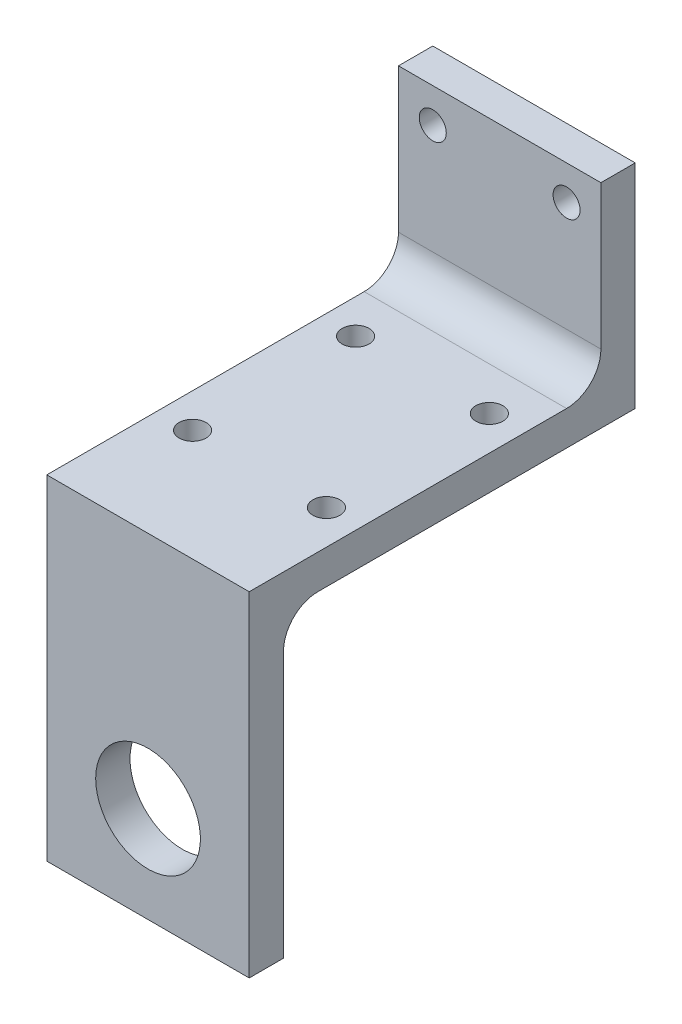
ISO-10303-21;
HEADER;
FILE_DESCRIPTION(('STEP AP214'),'2;1');
FILE_NAME('part.step','',(''),(''),'','','');
FILE_SCHEMA(('AUTOMOTIVE_DESIGN { 1 0 10303 214 1 1 1 1 }'));
ENDSEC;
DATA;
#1=APPLICATION_CONTEXT('core data for automotive mechanical design processes');
#2=APPLICATION_PROTOCOL_DEFINITION('international standard','automotive_design',2000,#1);
#3=PRODUCT_CONTEXT('',#1,'mechanical');
#4=PRODUCT('Part','Part','',(#3));
#5=PRODUCT_RELATED_PRODUCT_CATEGORY('part','',(#4));
#6=PRODUCT_DEFINITION_FORMATION('','',#4);
#7=PRODUCT_DEFINITION_CONTEXT('part definition',#1,'design');
#8=PRODUCT_DEFINITION('design','',#6,#7);
#9=PRODUCT_DEFINITION_SHAPE('','',#8);
#10=(LENGTH_UNIT() NAMED_UNIT(*) SI_UNIT(.MILLI.,.METRE.));
#11=(NAMED_UNIT(*) PLANE_ANGLE_UNIT() SI_UNIT($,.RADIAN.));
#12=(NAMED_UNIT(*) SI_UNIT($,.STERADIAN.) SOLID_ANGLE_UNIT());
#13=UNCERTAINTY_MEASURE_WITH_UNIT(LENGTH_MEASURE(1.E-05),#10,'distance_accuracy_value','');
#14=(GEOMETRIC_REPRESENTATION_CONTEXT(3) GLOBAL_UNCERTAINTY_ASSIGNED_CONTEXT((#13)) GLOBAL_UNIT_ASSIGNED_CONTEXT((#10,
#11,#12)) REPRESENTATION_CONTEXT('',''));
#15=CARTESIAN_POINT('',(0.,0.,0.));
#16=DIRECTION('',(0.,0.,1.));
#17=DIRECTION('',(1.,0.,0.));
#18=AXIS2_PLACEMENT_3D('',#15,#16,#17);
#19=CARTESIAN_POINT('',(29.972,0.,36.5701998870482));
#20=DIRECTION('',(0.,0.,-1.));
#21=DIRECTION('',(-1.,0.,0.));
#22=AXIS2_PLACEMENT_3D('',#19,#20,#21);
#23=PLANE('',#22);
#24=CARTESIAN_POINT('',(14.986,-43.1408439202567,36.5701998870482));
#25=DIRECTION('',(0.,0.,-1.));
#26=DIRECTION('',(-1.,0.,0.));
#27=AXIS2_PLACEMENT_3D('',#24,#25,#26);
#28=CIRCLE('',#27,7.75);
#29=CARTESIAN_POINT('',(7.236,-43.1408439202567,36.5701998870482));
#30=VERTEX_POINT('',#29);
#31=EDGE_CURVE('E624',#30,#30,#28,.T.);
#32=ORIENTED_EDGE('',*,*,#31,.F.);
#33=EDGE_LOOP('',(#32));
#34=FACE_BOUND('',#33,.T.);
#35=DIRECTION('',(0.,-1.,0.));
#36=VECTOR('',#35,1.);
#37=CARTESIAN_POINT('',(0.,0.,36.5701998870482));
#38=LINE('',#37,#36);
#39=CARTESIAN_POINT('',(0.,-17.9948439202567,36.5701998870482));
#40=VERTEX_POINT('',#39);
#41=CARTESIAN_POINT('',(0.,-57.3648439202567,36.5701998870482));
#42=VERTEX_POINT('',#41);
#43=EDGE_CURVE('E215',#40,#42,#38,.T.);
#44=ORIENTED_EDGE('',*,*,#43,.F.);
#45=DIRECTION('',(-1.,0.,0.));
#46=VECTOR('',#45,1.);
#47=CARTESIAN_POINT('',(29.972,-17.9948439202567,36.5701998870482));
#48=LINE('',#47,#46);
#49=CARTESIAN_POINT('',(29.972,-17.9948439202567,36.5701998870482));
#50=VERTEX_POINT('',#49);
#51=EDGE_CURVE('E226',#40,#50,#48,.F.);
#52=ORIENTED_EDGE('',*,*,#51,.T.);
#53=DIRECTION('',(0.,-1.,0.));
#54=VECTOR('',#53,1.);
#55=CARTESIAN_POINT('',(29.972,0.,36.5701998870482));
#56=LINE('',#55,#54);
#57=CARTESIAN_POINT('',(29.972,-57.3648439202567,36.5701998870482));
#58=VERTEX_POINT('',#57);
#59=EDGE_CURVE('E287',#50,#58,#56,.T.);
#60=ORIENTED_EDGE('',*,*,#59,.T.);
#61=DIRECTION('',(-1.,0.,0.));
#62=VECTOR('',#61,1.);
#63=CARTESIAN_POINT('',(29.972,-57.3648439202567,36.5701998870482));
#64=LINE('',#63,#62);
#65=EDGE_CURVE('E297',#58,#42,#64,.T.);
#66=ORIENTED_EDGE('',*,*,#65,.T.);
#67=EDGE_LOOP('',(#44,#52,#60,#66));
#68=FACE_BOUND('',#67,.T.);
#69=ADVANCED_FACE('F71',(#34,#68),#23,.T.);
#70=CARTESIAN_POINT('',(29.972,0.,41.6501998870482));
#71=DIRECTION('',(0.,0.,-1.));
#72=DIRECTION('',(-1.,0.,0.));
#73=AXIS2_PLACEMENT_3D('',#70,#71,#72);
#74=PLANE('',#73);
#75=CARTESIAN_POINT('',(14.986,-43.1408439202567,41.6501998870482));
#76=DIRECTION('',(0.,0.,-1.));
#77=DIRECTION('',(-1.,0.,0.));
#78=AXIS2_PLACEMENT_3D('',#75,#76,#77);
#79=CIRCLE('',#78,7.75);
#80=CARTESIAN_POINT('',(7.236,-43.1408439202567,41.6501998870482));
#81=VERTEX_POINT('',#80);
#82=EDGE_CURVE('E622',#81,#81,#79,.F.);
#83=ORIENTED_EDGE('',*,*,#82,.F.);
#84=EDGE_LOOP('',(#83));
#85=FACE_BOUND('',#84,.T.);
#86=DIRECTION('',(0.,-1.,0.));
#87=VECTOR('',#86,1.);
#88=CARTESIAN_POINT('',(0.,0.,41.6501998870482));
#89=LINE('',#88,#87);
#90=CARTESIAN_POINT('',(0.,-7.83484392025666,41.6501998870482));
#91=VERTEX_POINT('',#90);
#92=CARTESIAN_POINT('',(0.,-57.3648439202567,41.6501998870482));
#93=VERTEX_POINT('',#92);
#94=EDGE_CURVE('E220',#91,#93,#89,.T.);
#95=ORIENTED_EDGE('',*,*,#94,.T.);
#96=DIRECTION('',(-1.,0.,0.));
#97=VECTOR('',#96,1.);
#98=CARTESIAN_POINT('',(29.972,-57.3648439202567,41.6501998870482));
#99=LINE('',#98,#97);
#100=CARTESIAN_POINT('',(29.972,-57.3648439202567,41.6501998870482));
#101=VERTEX_POINT('',#100);
#102=EDGE_CURVE('E227',#101,#93,#99,.T.);
#103=ORIENTED_EDGE('',*,*,#102,.F.);
#104=DIRECTION('',(0.,-1.,0.));
#105=VECTOR('',#104,1.);
#106=CARTESIAN_POINT('',(29.972,0.,41.6501998870482));
#107=LINE('',#106,#105);
#108=CARTESIAN_POINT('',(29.972,-7.83484392025666,41.6501998870482));
#109=VERTEX_POINT('',#108);
#110=EDGE_CURVE('E290',#109,#101,#107,.T.);
#111=ORIENTED_EDGE('',*,*,#110,.F.);
#112=DIRECTION('',(-1.,0.,0.));
#113=VECTOR('',#112,1.);
#114=CARTESIAN_POINT('',(29.972,-7.83484392025666,41.6501998870482));
#115=LINE('',#114,#113);
#116=EDGE_CURVE('E211',#109,#91,#115,.T.);
#117=ORIENTED_EDGE('',*,*,#116,.T.);
#118=EDGE_LOOP('',(#95,#103,#111,#117));
#119=FACE_BOUND('',#118,.T.);
#120=ADVANCED_FACE('F367',(#85,#119),#74,.F.);
#121=CARTESIAN_POINT('',(29.972,-57.3648439202567,0.));
#122=DIRECTION('',(0.,1.,0.));
#123=DIRECTION('',(0.,0.,1.));
#124=AXIS2_PLACEMENT_3D('',#121,#122,#123);
#125=PLANE('',#124);
#126=DIRECTION('',(0.,0.,-1.));
#127=VECTOR('',#126,1.);
#128=CARTESIAN_POINT('',(0.,-57.3648439202567,0.));
#129=LINE('',#128,#127);
#130=EDGE_CURVE('E291',#93,#42,#129,.T.);
#131=ORIENTED_EDGE('',*,*,#130,.T.);
#132=ORIENTED_EDGE('',*,*,#65,.F.);
#133=DIRECTION('',(0.,0.,-1.));
#134=VECTOR('',#133,1.);
#135=CARTESIAN_POINT('',(29.972,-57.3648439202567,0.));
#136=LINE('',#135,#134);
#137=EDGE_CURVE('E294',#101,#58,#136,.T.);
#138=ORIENTED_EDGE('',*,*,#137,.F.);
#139=ORIENTED_EDGE('',*,*,#102,.T.);
#140=EDGE_LOOP('',(#131,#132,#138,#139));
#141=FACE_BOUND('',#140,.T.);
#142=ADVANCED_FACE('F372',(#141),#125,.F.);
#143=CARTESIAN_POINT('',(29.972,0.,0.));
#144=DIRECTION('',(1.,0.,0.));
#145=DIRECTION('',(0.,0.,-1.));
#146=AXIS2_PLACEMENT_3D('',#143,#144,#145);
#147=PLANE('',#146);
#148=ORIENTED_EDGE('',*,*,#59,.F.);
#149=CARTESIAN_POINT('',(29.972,-17.9948439202567,31.4901998870482));
#150=DIRECTION('',(1.,0.,0.));
#151=DIRECTION('',(0.,0.,-1.));
#152=AXIS2_PLACEMENT_3D('',#149,#150,#151);
#153=CIRCLE('',#152,5.08);
#154=CARTESIAN_POINT('',(29.972,-12.9148439202567,31.4901998870482));
#155=VERTEX_POINT('',#154);
#156=EDGE_CURVE('E240',#50,#155,#153,.F.);
#157=ORIENTED_EDGE('',*,*,#156,.T.);
#158=DIRECTION('',(0.,0.,1.));
#159=VECTOR('',#158,1.);
#160=CARTESIAN_POINT('',(29.972,-12.9148439202567,-15.4998001129518));
#161=LINE('',#160,#159);
#162=CARTESIAN_POINT('',(29.972,-12.9148439202567,-15.4998001129518));
#163=VERTEX_POINT('',#162);
#164=EDGE_CURVE('E313',#163,#155,#161,.T.);
#165=ORIENTED_EDGE('',*,*,#164,.F.);
#166=DIRECTION('',(0.,-1.,0.));
#167=VECTOR('',#166,1.);
#168=CARTESIAN_POINT('',(29.972,18.5811560797433,-15.4998001129518));
#169=LINE('',#168,#167);
#170=CARTESIAN_POINT('',(29.972,18.5811560797433,-15.4998001129518));
#171=VERTEX_POINT('',#170);
#172=EDGE_CURVE('E318',#171,#163,#169,.T.);
#173=ORIENTED_EDGE('',*,*,#172,.F.);
#174=DIRECTION('',(0.,0.,-1.));
#175=VECTOR('',#174,1.);
#176=CARTESIAN_POINT('',(29.972,18.5811560797433,-10.4198001129518));
#177=LINE('',#176,#175);
#178=CARTESIAN_POINT('',(29.972,18.5811560797433,-10.4198001129518));
#179=VERTEX_POINT('',#178);
#180=EDGE_CURVE('E321',#179,#171,#177,.T.);
#181=ORIENTED_EDGE('',*,*,#180,.F.);
#182=DIRECTION('',(0.,1.,0.));
#183=VECTOR('',#182,1.);
#184=CARTESIAN_POINT('',(29.972,-7.83484392025665,-10.4198001129518));
#185=LINE('',#184,#183);
#186=CARTESIAN_POINT('',(29.972,-2.75484392025665,-10.4198001129518));
#187=VERTEX_POINT('',#186);
#188=EDGE_CURVE('E325',#187,#179,#185,.T.);
#189=ORIENTED_EDGE('',*,*,#188,.F.);
#190=CARTESIAN_POINT('',(29.972,-2.75484392025665,-5.3398001129518));
#191=DIRECTION('',(1.,0.,0.));
#192=DIRECTION('',(0.,0.,-1.));
#193=AXIS2_PLACEMENT_3D('',#190,#191,#192);
#194=CIRCLE('',#193,5.08);
#195=CARTESIAN_POINT('',(29.972,-7.83484392025665,-5.3398001129518));
#196=VERTEX_POINT('',#195);
#197=EDGE_CURVE('E246',#187,#196,#194,.F.);
#198=ORIENTED_EDGE('',*,*,#197,.T.);
#199=DIRECTION('',(0.,0.,1.));
#200=VECTOR('',#199,1.);
#201=CARTESIAN_POINT('',(29.972,-7.83484392025665,-10.4198001129518));
#202=LINE('',#201,#200);
#203=EDGE_CURVE('E310',#196,#109,#202,.T.);
#204=ORIENTED_EDGE('',*,*,#203,.T.);
#205=ORIENTED_EDGE('',*,*,#110,.T.);
#206=ORIENTED_EDGE('',*,*,#137,.T.);
#207=EDGE_LOOP('',(#148,#157,#165,#173,#181,#189,#198,#204,#205,#206));
#208=FACE_BOUND('',#207,.T.);
#209=ADVANCED_FACE('F365',(#208),#147,.T.);
#210=CARTESIAN_POINT('',(0.,0.,0.));
#211=DIRECTION('',(1.,0.,0.));
#212=DIRECTION('',(0.,0.,-1.));
#213=AXIS2_PLACEMENT_3D('',#210,#211,#212);
#214=PLANE('',#213);
#215=DIRECTION('',(0.,0.,1.));
#216=VECTOR('',#215,1.);
#217=CARTESIAN_POINT('',(0.,-12.9148439202567,-15.4998001129518));
#218=LINE('',#217,#216);
#219=CARTESIAN_POINT('',(0.,-12.9148439202567,-15.4998001129518));
#220=VERTEX_POINT('',#219);
#221=CARTESIAN_POINT('',(0.,-12.9148439202567,31.4901998870482));
#222=VERTEX_POINT('',#221);
#223=EDGE_CURVE('E198',#220,#222,#218,.T.);
#224=ORIENTED_EDGE('',*,*,#223,.T.);
#225=CARTESIAN_POINT('',(0.,-17.9948439202567,31.4901998870482));
#226=DIRECTION('',(1.,0.,0.));
#227=DIRECTION('',(0.,0.,-1.));
#228=AXIS2_PLACEMENT_3D('',#225,#226,#227);
#229=CIRCLE('',#228,5.08);
#230=EDGE_CURVE('E237',#222,#40,#229,.T.);
#231=ORIENTED_EDGE('',*,*,#230,.T.);
#232=ORIENTED_EDGE('',*,*,#43,.T.);
#233=ORIENTED_EDGE('',*,*,#130,.F.);
#234=ORIENTED_EDGE('',*,*,#94,.F.);
#235=DIRECTION('',(0.,0.,1.));
#236=VECTOR('',#235,1.);
#237=CARTESIAN_POINT('',(0.,-7.83484392025665,-10.4198001129518));
#238=LINE('',#237,#236);
#239=CARTESIAN_POINT('',(0.,-7.83484392025665,-5.3398001129518));
#240=VERTEX_POINT('',#239);
#241=EDGE_CURVE('E286',#240,#91,#238,.T.);
#242=ORIENTED_EDGE('',*,*,#241,.F.);
#243=CARTESIAN_POINT('',(0.,-2.75484392025665,-5.3398001129518));
#244=DIRECTION('',(1.,0.,0.));
#245=DIRECTION('',(0.,0.,-1.));
#246=AXIS2_PLACEMENT_3D('',#243,#244,#245);
#247=CIRCLE('',#246,5.08);
#248=CARTESIAN_POINT('',(0.,-2.75484392025665,-10.4198001129518));
#249=VERTEX_POINT('',#248);
#250=EDGE_CURVE('E243',#240,#249,#247,.T.);
#251=ORIENTED_EDGE('',*,*,#250,.T.);
#252=DIRECTION('',(0.,1.,0.));
#253=VECTOR('',#252,1.);
#254=CARTESIAN_POINT('',(0.,-7.83484392025665,-10.4198001129518));
#255=LINE('',#254,#253);
#256=CARTESIAN_POINT('',(0.,18.5811560797433,-10.4198001129518));
#257=VERTEX_POINT('',#256);
#258=EDGE_CURVE('E314',#249,#257,#255,.T.);
#259=ORIENTED_EDGE('',*,*,#258,.T.);
#260=DIRECTION('',(0.,0.,-1.));
#261=VECTOR('',#260,1.);
#262=CARTESIAN_POINT('',(0.,18.5811560797433,-10.4198001129518));
#263=LINE('',#262,#261);
#264=CARTESIAN_POINT('',(0.,18.5811560797433,-15.4998001129518));
#265=VERTEX_POINT('',#264);
#266=EDGE_CURVE('E335',#257,#265,#263,.T.);
#267=ORIENTED_EDGE('',*,*,#266,.T.);
#268=DIRECTION('',(0.,-1.,0.));
#269=VECTOR('',#268,1.);
#270=CARTESIAN_POINT('',(0.,18.5811560797433,-15.4998001129518));
#271=LINE('',#270,#269);
#272=EDGE_CURVE('E332',#265,#220,#271,.T.);
#273=ORIENTED_EDGE('',*,*,#272,.T.);
#274=EDGE_LOOP('',(#224,#231,#232,#233,#234,#242,#251,#259,#267,#273));
#275=FACE_BOUND('',#274,.T.);
#276=ADVANCED_FACE('F354',(#275),#214,.F.);
#277=CARTESIAN_POINT('',(29.972,-7.83484392025665,-10.4198001129518));
#278=DIRECTION('',(0.,0.,1.));
#279=DIRECTION('',(1.,0.,0.));
#280=AXIS2_PLACEMENT_3D('',#277,#278,#279);
#281=PLANE('',#280);
#282=CARTESIAN_POINT('',(5.08,13.5011560797433,-10.4198001129518));
#283=DIRECTION('',(0.,0.,1.));
#284=DIRECTION('',(1.,0.,0.));
#285=AXIS2_PLACEMENT_3D('',#282,#283,#284);
#286=CIRCLE('',#285,2.);
#287=CARTESIAN_POINT('',(7.08,13.5011560797433,-10.4198001129518));
#288=VERTEX_POINT('',#287);
#289=EDGE_CURVE('E271',#288,#288,#286,.F.);
#290=ORIENTED_EDGE('',*,*,#289,.T.);
#291=EDGE_LOOP('',(#290));
#292=FACE_BOUND('',#291,.T.);
#293=CARTESIAN_POINT('',(24.892,13.5011560797433,-10.4198001129518));
#294=DIRECTION('',(0.,0.,1.));
#295=DIRECTION('',(1.,0.,0.));
#296=AXIS2_PLACEMENT_3D('',#293,#294,#295);
#297=CIRCLE('',#296,2.);
#298=CARTESIAN_POINT('',(26.892,13.5011560797433,-10.4198001129518));
#299=VERTEX_POINT('',#298);
#300=EDGE_CURVE('E282',#299,#299,#297,.F.);
#301=ORIENTED_EDGE('',*,*,#300,.T.);
#302=EDGE_LOOP('',(#301));
#303=FACE_BOUND('',#302,.T.);
#304=ORIENTED_EDGE('',*,*,#258,.F.);
#305=DIRECTION('',(-1.,0.,0.));
#306=VECTOR('',#305,1.);
#307=CARTESIAN_POINT('',(29.972,-2.75484392025665,-10.4198001129518));
#308=LINE('',#307,#306);
#309=EDGE_CURVE('E234',#249,#187,#308,.F.);
#310=ORIENTED_EDGE('',*,*,#309,.T.);
#311=ORIENTED_EDGE('',*,*,#188,.T.);
#312=DIRECTION('',(-1.,0.,0.));
#313=VECTOR('',#312,1.);
#314=CARTESIAN_POINT('',(29.972,18.5811560797433,-10.4198001129518));
#315=LINE('',#314,#313);
#316=EDGE_CURVE('E206',#179,#257,#315,.T.);
#317=ORIENTED_EDGE('',*,*,#316,.T.);
#318=EDGE_LOOP('',(#304,#310,#311,#317));
#319=FACE_BOUND('',#318,.T.);
#320=ADVANCED_FACE('F347',(#292,#303,#319),#281,.T.);
#321=CARTESIAN_POINT('',(29.972,18.5811560797433,-10.4198001129518));
#322=DIRECTION('',(0.,1.,0.));
#323=DIRECTION('',(0.,0.,1.));
#324=AXIS2_PLACEMENT_3D('',#321,#322,#323);
#325=PLANE('',#324);
#326=ORIENTED_EDGE('',*,*,#266,.F.);
#327=ORIENTED_EDGE('',*,*,#316,.F.);
#328=ORIENTED_EDGE('',*,*,#180,.T.);
#329=DIRECTION('',(-1.,0.,0.));
#330=VECTOR('',#329,1.);
#331=CARTESIAN_POINT('',(29.972,18.5811560797433,-15.4998001129518));
#332=LINE('',#331,#330);
#333=EDGE_CURVE('E201',#171,#265,#332,.T.);
#334=ORIENTED_EDGE('',*,*,#333,.T.);
#335=EDGE_LOOP('',(#326,#327,#328,#334));
#336=FACE_BOUND('',#335,.T.);
#337=ADVANCED_FACE('F352',(#336),#325,.T.);
#338=CARTESIAN_POINT('',(29.972,-7.83484392025665,-10.4198001129518));
#339=DIRECTION('',(0.,-1.,0.));
#340=DIRECTION('',(0.,0.,-1.));
#341=AXIS2_PLACEMENT_3D('',#338,#339,#340);
#342=PLANE('',#341);
#343=CARTESIAN_POINT('',(5.08,-7.83484392025665,1.01019988704819));
#344=DIRECTION('',(0.,-1.,0.));
#345=DIRECTION('',(0.,0.,-1.));
#346=AXIS2_PLACEMENT_3D('',#343,#344,#345);
#347=CIRCLE('',#346,2.);
#348=CARTESIAN_POINT('',(5.08,-7.83484392025665,-0.989800112951809));
#349=VERTEX_POINT('',#348);
#350=EDGE_CURVE('E276',#349,#349,#347,.T.);
#351=ORIENTED_EDGE('',*,*,#350,.T.);
#352=EDGE_LOOP('',(#351));
#353=FACE_BOUND('',#352,.T.);
#354=CARTESIAN_POINT('',(24.892,-7.83484392025666,25.1401998870482));
#355=DIRECTION('',(0.,-1.,0.));
#356=DIRECTION('',(0.,0.,-1.));
#357=AXIS2_PLACEMENT_3D('',#354,#355,#356);
#358=CIRCLE('',#357,2.);
#359=CARTESIAN_POINT('',(24.892,-7.83484392025666,23.1401998870482));
#360=VERTEX_POINT('',#359);
#361=EDGE_CURVE('E440',#360,#360,#358,.T.);
#362=ORIENTED_EDGE('',*,*,#361,.T.);
#363=EDGE_LOOP('',(#362));
#364=FACE_BOUND('',#363,.T.);
#365=CARTESIAN_POINT('',(5.08,-7.83484392025666,25.1401998870482));
#366=DIRECTION('',(0.,-1.,0.));
#367=DIRECTION('',(0.,0.,-1.));
#368=AXIS2_PLACEMENT_3D('',#365,#366,#367);
#369=CIRCLE('',#368,2.);
#370=CARTESIAN_POINT('',(5.08,-7.83484392025666,23.1401998870482));
#371=VERTEX_POINT('',#370);
#372=EDGE_CURVE('E432',#371,#371,#369,.T.);
#373=ORIENTED_EDGE('',*,*,#372,.T.);
#374=EDGE_LOOP('',(#373));
#375=FACE_BOUND('',#374,.T.);
#376=CARTESIAN_POINT('',(24.892,-7.83484392025665,1.01019988704819));
#377=DIRECTION('',(0.,-1.,0.));
#378=DIRECTION('',(0.,0.,-1.));
#379=AXIS2_PLACEMENT_3D('',#376,#377,#378);
#380=CIRCLE('',#379,2.);
#381=CARTESIAN_POINT('',(24.892,-7.83484392025665,-0.989800112951811));
#382=VERTEX_POINT('',#381);
#383=EDGE_CURVE('E427',#382,#382,#380,.T.);
#384=ORIENTED_EDGE('',*,*,#383,.T.);
#385=EDGE_LOOP('',(#384));
#386=FACE_BOUND('',#385,.T.);
#387=ORIENTED_EDGE('',*,*,#203,.F.);
#388=DIRECTION('',(-1.,0.,0.));
#389=VECTOR('',#388,1.);
#390=CARTESIAN_POINT('',(29.972,-7.83484392025665,-5.3398001129518));
#391=LINE('',#390,#389);
#392=EDGE_CURVE('E230',#196,#240,#391,.T.);
#393=ORIENTED_EDGE('',*,*,#392,.T.);
#394=ORIENTED_EDGE('',*,*,#241,.T.);
#395=ORIENTED_EDGE('',*,*,#116,.F.);
#396=EDGE_LOOP('',(#387,#393,#394,#395));
#397=FACE_BOUND('',#396,.T.);
#398=ADVANCED_FACE('F362',(#353,#364,#375,#386,#397),#342,.F.);
#399=CARTESIAN_POINT('',(29.972,18.5811560797433,-15.4998001129518));
#400=DIRECTION('',(0.,0.,-1.));
#401=DIRECTION('',(0.,1.,0.));
#402=AXIS2_PLACEMENT_3D('',#399,#400,#401);
#403=PLANE('',#402);
#404=CARTESIAN_POINT('',(24.892,-10.6288439202567,-15.4998001129518));
#405=DIRECTION('',(0.,0.,-1.));
#406=DIRECTION('',(-1.,0.,0.));
#407=AXIS2_PLACEMENT_3D('',#404,#405,#406);
#408=CIRCLE('',#407,4.);
#409=CARTESIAN_POINT('',(21.6095917377633,-12.9148439202567,-15.4998001129518));
#410=VERTEX_POINT('',#409);
#411=CARTESIAN_POINT('',(28.1744082622367,-12.9148439202567,-15.4998001129518));
#412=VERTEX_POINT('',#411);
#413=EDGE_CURVE('E94',#410,#412,#408,.T.);
#414=ORIENTED_EDGE('',*,*,#413,.F.);
#415=DIRECTION('',(-1.,0.,0.));
#416=VECTOR('',#415,1.);
#417=CARTESIAN_POINT('',(29.972,-12.9148439202567,-15.4998001129518));
#418=LINE('',#417,#416);
#419=CARTESIAN_POINT('',(8.36240826223674,-12.9148439202567,-15.4998001129518));
#420=VERTEX_POINT('',#419);
#421=EDGE_CURVE('E190',#410,#420,#418,.T.);
#422=ORIENTED_EDGE('',*,*,#421,.T.);
#423=CARTESIAN_POINT('',(5.08,-10.6288439202567,-15.4998001129518));
#424=DIRECTION('',(0.,0.,-1.));
#425=DIRECTION('',(-1.,0.,0.));
#426=AXIS2_PLACEMENT_3D('',#423,#424,#425);
#427=CIRCLE('',#426,4.);
#428=CARTESIAN_POINT('',(1.79759173776326,-12.9148439202567,-15.4998001129518));
#429=VERTEX_POINT('',#428);
#430=EDGE_CURVE('E87',#429,#420,#427,.T.);
#431=ORIENTED_EDGE('',*,*,#430,.F.);
#432=EDGE_CURVE('E187',#429,#220,#418,.T.);
#433=ORIENTED_EDGE('',*,*,#432,.T.);
#434=ORIENTED_EDGE('',*,*,#272,.F.);
#435=ORIENTED_EDGE('',*,*,#333,.F.);
#436=ORIENTED_EDGE('',*,*,#172,.T.);
#437=EDGE_CURVE('E203',#163,#412,#418,.T.);
#438=ORIENTED_EDGE('',*,*,#437,.T.);
#439=EDGE_LOOP('',(#414,#422,#431,#433,#434,#435,#436,#438));
#440=FACE_BOUND('',#439,.T.);
#441=CARTESIAN_POINT('',(5.08,13.5011560797433,-15.4998001129518));
#442=DIRECTION('',(0.,0.,-1.));
#443=DIRECTION('',(-1.,0.,0.));
#444=AXIS2_PLACEMENT_3D('',#441,#442,#443);
#445=CIRCLE('',#444,2.);
#446=CARTESIAN_POINT('',(3.08,13.5011560797433,-15.4998001129518));
#447=VERTEX_POINT('',#446);
#448=EDGE_CURVE('E267',#447,#447,#445,.T.);
#449=ORIENTED_EDGE('',*,*,#448,.F.);
#450=EDGE_LOOP('',(#449));
#451=FACE_BOUND('',#450,.T.);
#452=CARTESIAN_POINT('',(24.892,13.5011560797433,-15.4998001129518));
#453=DIRECTION('',(0.,0.,-1.));
#454=DIRECTION('',(-1.,0.,0.));
#455=AXIS2_PLACEMENT_3D('',#452,#453,#454);
#456=CIRCLE('',#455,2.);
#457=CARTESIAN_POINT('',(22.892,13.5011560797433,-15.4998001129518));
#458=VERTEX_POINT('',#457);
#459=EDGE_CURVE('E278',#458,#458,#456,.T.);
#460=ORIENTED_EDGE('',*,*,#459,.F.);
#461=EDGE_LOOP('',(#460));
#462=FACE_BOUND('',#461,.T.);
#463=ADVANCED_FACE('F184',(#440,#451,#462),#403,.T.);
#464=CARTESIAN_POINT('',(29.972,-12.9148439202567,-15.4998001129518));
#465=DIRECTION('',(0.,-1.,0.));
#466=DIRECTION('',(0.,0.,-1.));
#467=AXIS2_PLACEMENT_3D('',#464,#465,#466);
#468=PLANE('',#467);
#469=CARTESIAN_POINT('',(5.08,-12.9148439202567,1.01019988704819));
#470=DIRECTION('',(0.,-1.,0.));
#471=DIRECTION('',(0.,0.,-1.));
#472=AXIS2_PLACEMENT_3D('',#469,#470,#471);
#473=CIRCLE('',#472,2.);
#474=CARTESIAN_POINT('',(5.08,-12.9148439202567,-0.989800112951809));
#475=VERTEX_POINT('',#474);
#476=EDGE_CURVE('E413',#475,#475,#473,.T.);
#477=ORIENTED_EDGE('',*,*,#476,.F.);
#478=EDGE_LOOP('',(#477));
#479=FACE_BOUND('',#478,.T.);
#480=CARTESIAN_POINT('',(24.892,-12.9148439202567,25.1401998870482));
#481=DIRECTION('',(0.,-1.,0.));
#482=DIRECTION('',(0.,0.,-1.));
#483=AXIS2_PLACEMENT_3D('',#480,#481,#482);
#484=CIRCLE('',#483,2.);
#485=CARTESIAN_POINT('',(24.892,-12.9148439202567,23.1401998870482));
#486=VERTEX_POINT('',#485);
#487=EDGE_CURVE('E417',#486,#486,#484,.T.);
#488=ORIENTED_EDGE('',*,*,#487,.F.);
#489=EDGE_LOOP('',(#488));
#490=FACE_BOUND('',#489,.T.);
#491=CARTESIAN_POINT('',(5.08,-12.9148439202567,25.1401998870482));
#492=DIRECTION('',(0.,-1.,0.));
#493=DIRECTION('',(0.,0.,-1.));
#494=AXIS2_PLACEMENT_3D('',#491,#492,#493);
#495=CIRCLE('',#494,2.);
#496=CARTESIAN_POINT('',(5.08,-12.9148439202567,23.1401998870482));
#497=VERTEX_POINT('',#496);
#498=EDGE_CURVE('E421',#497,#497,#495,.T.);
#499=ORIENTED_EDGE('',*,*,#498,.F.);
#500=EDGE_LOOP('',(#499));
#501=FACE_BOUND('',#500,.T.);
#502=CARTESIAN_POINT('',(24.892,-12.9148439202567,1.01019988704819));
#503=DIRECTION('',(0.,-1.,0.));
#504=DIRECTION('',(0.,0.,-1.));
#505=AXIS2_PLACEMENT_3D('',#502,#503,#504);
#506=CIRCLE('',#505,2.);
#507=CARTESIAN_POINT('',(24.892,-12.9148439202567,-0.989800112951811));
#508=VERTEX_POINT('',#507);
#509=EDGE_CURVE('E424',#508,#508,#506,.T.);
#510=ORIENTED_EDGE('',*,*,#509,.F.);
#511=EDGE_LOOP('',(#510));
#512=FACE_BOUND('',#511,.T.);
#513=DIRECTION('',(0.,0.,-1.));
#514=VECTOR('',#513,1.);
#515=CARTESIAN_POINT('',(21.6095917377633,-12.9148439202567,0.893908386032956));
#516=LINE('',#515,#514);
#517=CARTESIAN_POINT('',(21.6095917377633,-12.9148439202567,-10.4198001129518));
#518=VERTEX_POINT('',#517);
#519=EDGE_CURVE('E12',#518,#410,#516,.T.);
#520=ORIENTED_EDGE('',*,*,#519,.F.);
#521=DIRECTION('',(-1.,0.,0.));
#522=VECTOR('',#521,1.);
#523=CARTESIAN_POINT('',(29.972,-12.9148439202567,-10.4198001129518));
#524=LINE('',#523,#522);
#525=CARTESIAN_POINT('',(28.1744082622367,-12.9148439202567,-10.4198001129518));
#526=VERTEX_POINT('',#525);
#527=EDGE_CURVE('E80',#526,#518,#524,.T.);
#528=ORIENTED_EDGE('',*,*,#527,.F.);
#529=DIRECTION('',(0.,0.,-1.));
#530=VECTOR('',#529,1.);
#531=CARTESIAN_POINT('',(28.1744082622367,-12.9148439202567,0.893908386032956));
#532=LINE('',#531,#530);
#533=EDGE_CURVE('E179',#412,#526,#532,.F.);
#534=ORIENTED_EDGE('',*,*,#533,.F.);
#535=ORIENTED_EDGE('',*,*,#437,.F.);
#536=ORIENTED_EDGE('',*,*,#164,.T.);
#537=DIRECTION('',(-1.,0.,0.));
#538=VECTOR('',#537,1.);
#539=CARTESIAN_POINT('',(0.,-12.9148439202567,31.4901998870482));
#540=LINE('',#539,#538);
#541=EDGE_CURVE('E223',#155,#222,#540,.T.);
#542=ORIENTED_EDGE('',*,*,#541,.T.);
#543=ORIENTED_EDGE('',*,*,#223,.F.);
#544=ORIENTED_EDGE('',*,*,#432,.F.);
#545=DIRECTION('',(0.,0.,-1.));
#546=VECTOR('',#545,1.);
#547=CARTESIAN_POINT('',(1.79759173776326,-12.9148439202567,0.893908386032956));
#548=LINE('',#547,#546);
#549=CARTESIAN_POINT('',(1.79759173776326,-12.9148439202567,-10.4198001129518));
#550=VERTEX_POINT('',#549);
#551=EDGE_CURVE('E171',#550,#429,#548,.T.);
#552=ORIENTED_EDGE('',*,*,#551,.F.);
#553=DIRECTION('',(-1.,0.,0.));
#554=VECTOR('',#553,1.);
#555=CARTESIAN_POINT('',(29.972,-12.9148439202567,-10.4198001129518));
#556=LINE('',#555,#554);
#557=CARTESIAN_POINT('',(8.36240826223674,-12.9148439202567,-10.4198001129518));
#558=VERTEX_POINT('',#557);
#559=EDGE_CURVE('E180',#558,#550,#556,.T.);
#560=ORIENTED_EDGE('',*,*,#559,.F.);
#561=DIRECTION('',(0.,0.,-1.));
#562=VECTOR('',#561,1.);
#563=CARTESIAN_POINT('',(8.36240826223674,-12.9148439202567,0.893908386032956));
#564=LINE('',#563,#562);
#565=EDGE_CURVE('E249',#420,#558,#564,.F.);
#566=ORIENTED_EDGE('',*,*,#565,.F.);
#567=ORIENTED_EDGE('',*,*,#421,.F.);
#568=EDGE_LOOP('',(#520,#528,#534,#535,#536,#542,#543,#544,#552,#560,#566,#567));
#569=FACE_BOUND('',#568,.T.);
#570=ADVANCED_FACE('F195',(#479,#490,#501,#512,#569),#468,.T.);
#571=CARTESIAN_POINT('',(29.972,-17.9948439202567,31.4901998870482));
#572=DIRECTION('',(1.,0.,0.));
#573=DIRECTION('',(0.,0.,-1.));
#574=AXIS2_PLACEMENT_3D('',#571,#572,#573);
#575=CYLINDRICAL_SURFACE('',#574,5.08);
#576=ORIENTED_EDGE('',*,*,#156,.F.);
#577=ORIENTED_EDGE('',*,*,#51,.F.);
#578=ORIENTED_EDGE('',*,*,#230,.F.);
#579=ORIENTED_EDGE('',*,*,#541,.F.);
#580=EDGE_LOOP('',(#576,#577,#578,#579));
#581=FACE_BOUND('',#580,.T.);
#582=ADVANCED_FACE('F379',(#581),#575,.F.);
#583=CARTESIAN_POINT('',(29.972,-2.75484392025665,-5.3398001129518));
#584=DIRECTION('',(-1.,0.,0.));
#585=DIRECTION('',(0.,0.,1.));
#586=AXIS2_PLACEMENT_3D('',#583,#584,#585);
#587=CYLINDRICAL_SURFACE('',#586,5.08);
#588=ORIENTED_EDGE('',*,*,#197,.F.);
#589=ORIENTED_EDGE('',*,*,#309,.F.);
#590=ORIENTED_EDGE('',*,*,#250,.F.);
#591=ORIENTED_EDGE('',*,*,#392,.F.);
#592=EDGE_LOOP('',(#588,#589,#590,#591));
#593=FACE_BOUND('',#592,.T.);
#594=ADVANCED_FACE('F73',(#593),#587,.F.);
#595=CARTESIAN_POINT('',(29.972,-7.83484392025665,-10.4198001129518));
#596=DIRECTION('',(0.,0.,1.));
#597=DIRECTION('',(1.,0.,0.));
#598=AXIS2_PLACEMENT_3D('',#595,#596,#597);
#599=PLANE('',#598);
#600=ORIENTED_EDGE('',*,*,#559,.T.);
#601=CARTESIAN_POINT('',(5.08,-10.6288439202567,-10.4198001129518));
#602=DIRECTION('',(0.,0.,1.));
#603=DIRECTION('',(1.,0.,0.));
#604=AXIS2_PLACEMENT_3D('',#601,#602,#603);
#605=CIRCLE('',#604,4.);
#606=EDGE_CURVE('E174',#550,#558,#605,.F.);
#607=ORIENTED_EDGE('',*,*,#606,.T.);
#608=EDGE_LOOP('',(#600,#607));
#609=FACE_BOUND('',#608,.T.);
#610=ADVANCED_FACE('F265',(#609),#599,.F.);
#611=CARTESIAN_POINT('',(5.08,-10.6288439202567,0.893908386032956));
#612=DIRECTION('',(0.,0.,-1.));
#613=DIRECTION('',(-1.,0.,0.));
#614=AXIS2_PLACEMENT_3D('',#611,#612,#613);
#615=CYLINDRICAL_SURFACE('',#614,4.);
#616=ORIENTED_EDGE('',*,*,#551,.T.);
#617=ORIENTED_EDGE('',*,*,#430,.T.);
#618=ORIENTED_EDGE('',*,*,#565,.T.);
#619=ORIENTED_EDGE('',*,*,#606,.F.);
#620=EDGE_LOOP('',(#616,#617,#618,#619));
#621=FACE_BOUND('',#620,.T.);
#622=ADVANCED_FACE('F172',(#621),#615,.F.);
#623=CARTESIAN_POINT('',(29.972,-7.83484392025665,-10.4198001129518));
#624=DIRECTION('',(0.,0.,1.));
#625=DIRECTION('',(1.,0.,0.));
#626=AXIS2_PLACEMENT_3D('',#623,#624,#625);
#627=PLANE('',#626);
#628=ORIENTED_EDGE('',*,*,#527,.T.);
#629=CARTESIAN_POINT('',(24.892,-10.6288439202567,-10.4198001129518));
#630=DIRECTION('',(0.,0.,1.));
#631=DIRECTION('',(1.,0.,0.));
#632=AXIS2_PLACEMENT_3D('',#629,#630,#631);
#633=CIRCLE('',#632,4.);
#634=EDGE_CURVE('E192',#518,#526,#633,.F.);
#635=ORIENTED_EDGE('',*,*,#634,.T.);
#636=EDGE_LOOP('',(#628,#635));
#637=FACE_BOUND('',#636,.T.);
#638=ADVANCED_FACE('F260',(#637),#627,.F.);
#639=CARTESIAN_POINT('',(24.892,-10.6288439202567,0.893908386032956));
#640=DIRECTION('',(0.,0.,-1.));
#641=DIRECTION('',(-1.,0.,0.));
#642=AXIS2_PLACEMENT_3D('',#639,#640,#641);
#643=CYLINDRICAL_SURFACE('',#642,4.);
#644=ORIENTED_EDGE('',*,*,#519,.T.);
#645=ORIENTED_EDGE('',*,*,#413,.T.);
#646=ORIENTED_EDGE('',*,*,#533,.T.);
#647=ORIENTED_EDGE('',*,*,#634,.F.);
#648=EDGE_LOOP('',(#644,#645,#646,#647));
#649=FACE_BOUND('',#648,.T.);
#650=ADVANCED_FACE('F261',(#649),#643,.F.);
#651=CARTESIAN_POINT('',(24.892,13.5011560797433,0.893908386032956));
#652=DIRECTION('',(0.,0.,-1.));
#653=DIRECTION('',(-1.,0.,0.));
#654=AXIS2_PLACEMENT_3D('',#651,#652,#653);
#655=CYLINDRICAL_SURFACE('',#654,2.);
#656=ORIENTED_EDGE('',*,*,#459,.T.);
#657=EDGE_LOOP('',(#656));
#658=FACE_BOUND('',#657,.T.);
#659=ORIENTED_EDGE('',*,*,#300,.F.);
#660=EDGE_LOOP('',(#659));
#661=FACE_BOUND('',#660,.T.);
#662=ADVANCED_FACE('F453',(#658,#661),#655,.F.);
#663=CARTESIAN_POINT('',(5.08,13.5011560797433,0.893908386032956));
#664=DIRECTION('',(0.,0.,-1.));
#665=DIRECTION('',(-1.,0.,0.));
#666=AXIS2_PLACEMENT_3D('',#663,#664,#665);
#667=CYLINDRICAL_SURFACE('',#666,2.);
#668=ORIENTED_EDGE('',*,*,#448,.T.);
#669=EDGE_LOOP('',(#668));
#670=FACE_BOUND('',#669,.T.);
#671=ORIENTED_EDGE('',*,*,#289,.F.);
#672=EDGE_LOOP('',(#671));
#673=FACE_BOUND('',#672,.T.);
#674=ADVANCED_FACE('F450',(#670,#673),#667,.F.);
#675=CARTESIAN_POINT('',(24.892,17.0571560797433,1.0101998870482));
#676=DIRECTION('',(0.,-1.,0.));
#677=DIRECTION('',(0.,0.,-1.));
#678=AXIS2_PLACEMENT_3D('',#675,#676,#677);
#679=CYLINDRICAL_SURFACE('',#678,2.);
#680=ORIENTED_EDGE('',*,*,#509,.T.);
#681=EDGE_LOOP('',(#680));
#682=FACE_BOUND('',#681,.T.);
#683=ORIENTED_EDGE('',*,*,#383,.F.);
#684=EDGE_LOOP('',(#683));
#685=FACE_BOUND('',#684,.T.);
#686=ADVANCED_FACE('F452',(#682,#685),#679,.F.);
#687=CARTESIAN_POINT('',(5.08,17.0571560797433,25.1401998870482));
#688=DIRECTION('',(0.,-1.,0.));
#689=DIRECTION('',(0.,0.,-1.));
#690=AXIS2_PLACEMENT_3D('',#687,#688,#689);
#691=CYLINDRICAL_SURFACE('',#690,2.);
#692=ORIENTED_EDGE('',*,*,#498,.T.);
#693=EDGE_LOOP('',(#692));
#694=FACE_BOUND('',#693,.T.);
#695=ORIENTED_EDGE('',*,*,#372,.F.);
#696=EDGE_LOOP('',(#695));
#697=FACE_BOUND('',#696,.T.);
#698=ADVANCED_FACE('F460',(#694,#697),#691,.F.);
#699=CARTESIAN_POINT('',(24.892,17.0571560797433,25.1401998870482));
#700=DIRECTION('',(0.,-1.,0.));
#701=DIRECTION('',(0.,0.,-1.));
#702=AXIS2_PLACEMENT_3D('',#699,#700,#701);
#703=CYLINDRICAL_SURFACE('',#702,2.);
#704=ORIENTED_EDGE('',*,*,#487,.T.);
#705=EDGE_LOOP('',(#704));
#706=FACE_BOUND('',#705,.T.);
#707=ORIENTED_EDGE('',*,*,#361,.F.);
#708=EDGE_LOOP('',(#707));
#709=FACE_BOUND('',#708,.T.);
#710=ADVANCED_FACE('F569',(#706,#709),#703,.F.);
#711=CARTESIAN_POINT('',(5.08,17.0571560797433,1.0101998870482));
#712=DIRECTION('',(0.,-1.,0.));
#713=DIRECTION('',(0.,0.,-1.));
#714=AXIS2_PLACEMENT_3D('',#711,#712,#713);
#715=CYLINDRICAL_SURFACE('',#714,2.);
#716=ORIENTED_EDGE('',*,*,#476,.T.);
#717=EDGE_LOOP('',(#716));
#718=FACE_BOUND('',#717,.T.);
#719=ORIENTED_EDGE('',*,*,#350,.F.);
#720=EDGE_LOOP('',(#719));
#721=FACE_BOUND('',#720,.T.);
#722=ADVANCED_FACE('F578',(#718,#721),#715,.F.);
#723=CARTESIAN_POINT('',(14.986,-43.1408439202567,63.5705101038312));
#724=DIRECTION('',(0.,0.,-1.));
#725=DIRECTION('',(-1.,0.,0.));
#726=AXIS2_PLACEMENT_3D('',#723,#724,#725);
#727=CYLINDRICAL_SURFACE('',#726,7.75);
#728=ORIENTED_EDGE('',*,*,#82,.T.);
#729=EDGE_LOOP('',(#728));
#730=FACE_BOUND('',#729,.T.);
#731=ORIENTED_EDGE('',*,*,#31,.T.);
#732=EDGE_LOOP('',(#731));
#733=FACE_BOUND('',#732,.T.);
#734=ADVANCED_FACE('F586',(#730,#733),#727,.F.);
#735=CLOSED_SHELL('',(#69,#120,#142,#209,#276,#320,#337,#398,#463,#570,#582,#594,#610,#622,#638,
#650,#662,#674,#686,#698,#710,#722,#734));
#736=MANIFOLD_SOLID_BREP('B2',#735);
#737=ADVANCED_BREP_SHAPE_REPRESENTATION('',(#18,#736),#14);
#738=SHAPE_DEFINITION_REPRESENTATION(#9,#737);
ENDSEC;
END-ISO-10303-21;
